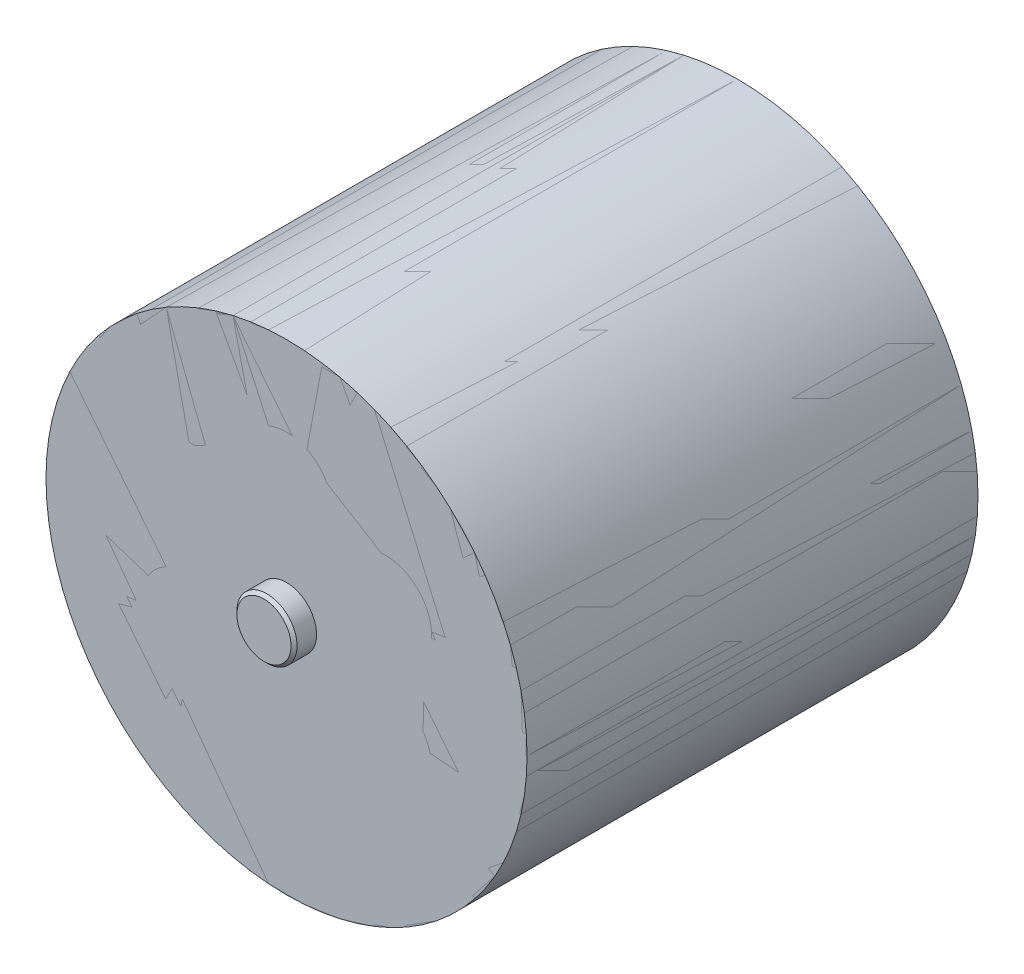
ISO-10303-21;
HEADER;
FILE_DESCRIPTION(('STEP AP214'),'2;1');
FILE_NAME('part.step','',(''),(''),'','','');
FILE_SCHEMA(('AUTOMOTIVE_DESIGN { 1 0 10303 214 1 1 1 1 }'));
ENDSEC;
DATA;
#1=APPLICATION_CONTEXT('core data for automotive mechanical design processes');
#2=APPLICATION_PROTOCOL_DEFINITION('international standard','automotive_design',2000,#1);
#3=PRODUCT_CONTEXT('',#1,'mechanical');
#4=PRODUCT('Part','Part','',(#3));
#5=PRODUCT_RELATED_PRODUCT_CATEGORY('part','',(#4));
#6=PRODUCT_DEFINITION_FORMATION('','',#4);
#7=PRODUCT_DEFINITION_CONTEXT('part definition',#1,'design');
#8=PRODUCT_DEFINITION('design','',#6,#7);
#9=PRODUCT_DEFINITION_SHAPE('','',#8);
#10=(LENGTH_UNIT() NAMED_UNIT(*) SI_UNIT(.MILLI.,.METRE.));
#11=(NAMED_UNIT(*) PLANE_ANGLE_UNIT() SI_UNIT($,.RADIAN.));
#12=(NAMED_UNIT(*) SI_UNIT($,.STERADIAN.) SOLID_ANGLE_UNIT());
#13=UNCERTAINTY_MEASURE_WITH_UNIT(LENGTH_MEASURE(1.E-05),#10,'distance_accuracy_value','');
#14=(GEOMETRIC_REPRESENTATION_CONTEXT(3) GLOBAL_UNCERTAINTY_ASSIGNED_CONTEXT((#13)) GLOBAL_UNIT_ASSIGNED_CONTEXT((#10,
#11,#12)) REPRESENTATION_CONTEXT('',''));
#15=CARTESIAN_POINT('',(0.,0.,0.));
#16=DIRECTION('',(0.,0.,1.));
#17=DIRECTION('',(1.,0.,0.));
#18=AXIS2_PLACEMENT_3D('',#15,#16,#17);
#19=CARTESIAN_POINT('',(271.211975438826,413.994449049259,-602.54833995939));
#20=DIRECTION('',(0.,0.,1.));
#21=DIRECTION('',(1.,0.,0.));
#22=AXIS2_PLACEMENT_3D('',#19,#20,#21);
#23=CYLINDRICAL_SURFACE('',#22,160.);
#24=CARTESIAN_POINT('',(271.211975438826,413.994449049259,-150.));
#25=DIRECTION('',(0.,0.,1.));
#26=DIRECTION('',(1.,0.,0.));
#27=AXIS2_PLACEMENT_3D('',#24,#25,#26);
#28=CIRCLE('',#27,160.);
#29=CARTESIAN_POINT('',(431.211975438826,413.994449049259,-150.));
#30=VERTEX_POINT('',#29);
#31=EDGE_CURVE('E11',#30,#30,#28,.F.);
#32=ORIENTED_EDGE('',*,*,#31,.F.);
#33=EDGE_LOOP('',(#32));
#34=FACE_BOUND('',#33,.T.);
#35=CARTESIAN_POINT('',(271.211975438826,413.994449049259,150.));
#36=DIRECTION('',(0.,0.,1.));
#37=DIRECTION('',(1.,0.,0.));
#38=AXIS2_PLACEMENT_3D('',#35,#36,#37);
#39=CIRCLE('',#38,160.);
#40=CARTESIAN_POINT('',(431.211975438826,413.994449049259,150.));
#41=VERTEX_POINT('',#40);
#42=EDGE_CURVE('E49',#41,#41,#39,.T.);
#43=ORIENTED_EDGE('',*,*,#42,.F.);
#44=EDGE_LOOP('',(#43));
#45=FACE_BOUND('',#44,.T.);
#46=ADVANCED_FACE('F43',(#34,#45),#23,.T.);
#47=CARTESIAN_POINT('',(271.211975438826,413.994449049259,150.));
#48=DIRECTION('',(0.,0.,1.));
#49=DIRECTION('',(1.,0.,0.));
#50=AXIS2_PLACEMENT_3D('',#47,#48,#49);
#51=PLANE('',#50);
#52=ORIENTED_EDGE('',*,*,#42,.T.);
#53=EDGE_LOOP('',(#52));
#54=FACE_BOUND('',#53,.T.);
#55=ADVANCED_FACE('F55',(#54),#51,.T.);
#56=CARTESIAN_POINT('',(271.211975438826,413.994449049259,-150.));
#57=DIRECTION('',(0.,0.,1.));
#58=DIRECTION('',(1.,0.,0.));
#59=AXIS2_PLACEMENT_3D('',#56,#57,#58);
#60=PLANE('',#59);
#61=ORIENTED_EDGE('',*,*,#31,.T.);
#62=EDGE_LOOP('',(#61));
#63=FACE_BOUND('',#62,.T.);
#64=ADVANCED_FACE('F62',(#63),#60,.F.);
#65=CLOSED_SHELL('',(#46,#55,#64));
#66=MANIFOLD_SOLID_BREP('B2',#65);
#67=CARTESIAN_POINT('',(271.211975438826,413.994449049259,150.));
#68=DIRECTION('',(0.,0.,1.));
#69=DIRECTION('',(1.,0.,0.));
#70=AXIS2_PLACEMENT_3D('',#67,#68,#69);
#71=PLANE('',#70);
#72=CARTESIAN_POINT('',(271.211975438826,413.994449049259,150.));
#73=DIRECTION('',(0.,0.,1.));
#74=DIRECTION('',(1.,0.,0.));
#75=AXIS2_PLACEMENT_3D('',#72,#73,#74);
#76=CIRCLE('',#75,160.);
#77=CARTESIAN_POINT('',(431.211975438826,413.994449049259,150.));
#78=VERTEX_POINT('',#77);
#79=EDGE_CURVE('E99',#78,#78,#76,.T.);
#80=ORIENTED_EDGE('',*,*,#79,.T.);
#81=EDGE_LOOP('',(#80));
#82=FACE_BOUND('',#81,.T.);
#83=CARTESIAN_POINT('',(271.211975438826,490.065575895642,150.));
#84=DIRECTION('',(0.,0.,1.));
#85=DIRECTION('',(1.,0.,0.));
#86=AXIS2_PLACEMENT_3D('',#83,#84,#85);
#87=CIRCLE('',#86,30.583998029491);
#88=CARTESIAN_POINT('',(301.795973468317,490.065575895642,150.));
#89=VERTEX_POINT('',#88);
#90=EDGE_CURVE('E105',#89,#89,#87,.T.);
#91=ORIENTED_EDGE('',*,*,#90,.F.);
#92=EDGE_LOOP('',(#91));
#93=FACE_BOUND('',#92,.T.);
#94=CARTESIAN_POINT('',(337.091503782302,452.03001247245,150.));
#95=DIRECTION('',(0.,0.,1.));
#96=DIRECTION('',(0.499999999999998,-0.86602540378444,0.));
#97=AXIS2_PLACEMENT_3D('',#94,#95,#96);
#98=CIRCLE('',#97,30.583998029491);
#99=CARTESIAN_POINT('',(352.383502797047,425.543493229618,150.));
#100=VERTEX_POINT('',#99);
#101=EDGE_CURVE('E111',#100,#100,#98,.T.);
#102=ORIENTED_EDGE('',*,*,#101,.F.);
#103=EDGE_LOOP('',(#102));
#104=FACE_BOUND('',#103,.T.);
#105=CARTESIAN_POINT('',(337.091503782301,375.958885626067,150.));
#106=DIRECTION('',(0.,0.,1.));
#107=DIRECTION('',(-0.500000000000004,-0.866025403784436,0.));
#108=AXIS2_PLACEMENT_3D('',#105,#106,#107);
#109=CIRCLE('',#108,30.583998029491);
#110=CARTESIAN_POINT('',(321.799504767556,349.472366383235,150.));
#111=VERTEX_POINT('',#110);
#112=EDGE_CURVE('E117',#111,#111,#109,.T.);
#113=ORIENTED_EDGE('',*,*,#112,.F.);
#114=EDGE_LOOP('',(#113));
#115=FACE_BOUND('',#114,.T.);
#116=CARTESIAN_POINT('',(271.211975438826,337.923322202876,150.));
#117=DIRECTION('',(0.,0.,1.));
#118=DIRECTION('',(-1.,0.,0.));
#119=AXIS2_PLACEMENT_3D('',#116,#117,#118);
#120=CIRCLE('',#119,30.583998029491);
#121=CARTESIAN_POINT('',(240.627977409335,337.923322202876,150.));
#122=VERTEX_POINT('',#121);
#123=EDGE_CURVE('E123',#122,#122,#120,.T.);
#124=ORIENTED_EDGE('',*,*,#123,.F.);
#125=EDGE_LOOP('',(#124));
#126=FACE_BOUND('',#125,.T.);
#127=CARTESIAN_POINT('',(205.332447095349,375.958885626068,150.));
#128=DIRECTION('',(0.,0.,1.));
#129=DIRECTION('',(-0.499999999999992,0.866025403784443,0.));
#130=AXIS2_PLACEMENT_3D('',#127,#128,#129);
#131=CIRCLE('',#130,30.583998029491);
#132=CARTESIAN_POINT('',(190.040448080604,402.4454048689,150.));
#133=VERTEX_POINT('',#132);
#134=EDGE_CURVE('E129',#133,#133,#131,.T.);
#135=ORIENTED_EDGE('',*,*,#134,.F.);
#136=EDGE_LOOP('',(#135));
#137=FACE_BOUND('',#136,.T.);
#138=CARTESIAN_POINT('',(205.33244709535,452.030012472451,150.));
#139=DIRECTION('',(0.,0.,1.));
#140=DIRECTION('',(0.50000000000001,0.866025403784433,0.));
#141=AXIS2_PLACEMENT_3D('',#138,#139,#140);
#142=CIRCLE('',#141,30.583998029491);
#143=CARTESIAN_POINT('',(220.624446110096,478.516531715283,150.));
#144=VERTEX_POINT('',#143);
#145=EDGE_CURVE('E135',#144,#144,#142,.T.);
#146=ORIENTED_EDGE('',*,*,#145,.F.);
#147=EDGE_LOOP('',(#146));
#148=FACE_BOUND('',#147,.T.);
#149=CARTESIAN_POINT('',(271.211975438826,413.994449049259,150.));
#150=DIRECTION('',(0.,0.,1.));
#151=DIRECTION('',(1.,0.,0.));
#152=AXIS2_PLACEMENT_3D('',#149,#150,#151);
#153=CIRCLE('',#152,20.);
#154=CARTESIAN_POINT('',(291.211975438826,413.994449049259,150.));
#155=VERTEX_POINT('',#154);
#156=EDGE_CURVE('E174',#155,#155,#153,.T.);
#157=ORIENTED_EDGE('',*,*,#156,.F.);
#158=EDGE_LOOP('',(#157));
#159=FACE_BOUND('',#158,.T.);
#160=ADVANCED_FACE('F84',(#82,#93,#104,#115,#126,#137,#148,#159),#71,.T.);
#161=CARTESIAN_POINT('',(271.211975438826,413.994449049259,-150.));
#162=DIRECTION('',(0.,0.,1.));
#163=DIRECTION('',(1.,0.,0.));
#164=AXIS2_PLACEMENT_3D('',#161,#162,#163);
#165=PLANE('',#164);
#166=CARTESIAN_POINT('',(271.211975438826,413.994449049259,-150.));
#167=DIRECTION('',(0.,0.,1.));
#168=DIRECTION('',(1.,0.,0.));
#169=AXIS2_PLACEMENT_3D('',#166,#167,#168);
#170=CIRCLE('',#169,20.);
#171=CARTESIAN_POINT('',(291.211975438826,413.994449049259,-150.));
#172=VERTEX_POINT('',#171);
#173=EDGE_CURVE('E180',#172,#172,#170,.T.);
#174=ORIENTED_EDGE('',*,*,#173,.T.);
#175=EDGE_LOOP('',(#174));
#176=FACE_BOUND('',#175,.T.);
#177=CARTESIAN_POINT('',(205.332447095349,375.958885626068,-150.));
#178=DIRECTION('',(0.,0.,1.));
#179=DIRECTION('',(-0.499999999999992,0.866025403784443,0.));
#180=AXIS2_PLACEMENT_3D('',#177,#178,#179);
#181=CIRCLE('',#180,30.583998029491);
#182=CARTESIAN_POINT('',(190.040448080604,402.4454048689,-150.));
#183=VERTEX_POINT('',#182);
#184=EDGE_CURVE('E165',#183,#183,#181,.T.);
#185=ORIENTED_EDGE('',*,*,#184,.T.);
#186=EDGE_LOOP('',(#185));
#187=FACE_BOUND('',#186,.T.);
#188=CARTESIAN_POINT('',(337.091503782301,375.958885626067,-150.));
#189=DIRECTION('',(0.,0.,1.));
#190=DIRECTION('',(-0.500000000000004,-0.866025403784436,0.));
#191=AXIS2_PLACEMENT_3D('',#188,#189,#190);
#192=CIRCLE('',#191,30.583998029491);
#193=CARTESIAN_POINT('',(321.799504767556,349.472366383235,-150.));
#194=VERTEX_POINT('',#193);
#195=EDGE_CURVE('E153',#194,#194,#192,.T.);
#196=ORIENTED_EDGE('',*,*,#195,.T.);
#197=EDGE_LOOP('',(#196));
#198=FACE_BOUND('',#197,.T.);
#199=CARTESIAN_POINT('',(271.211975438826,490.065575895642,-150.));
#200=DIRECTION('',(0.,0.,1.));
#201=DIRECTION('',(1.,0.,0.));
#202=AXIS2_PLACEMENT_3D('',#199,#200,#201);
#203=CIRCLE('',#202,30.583998029491);
#204=CARTESIAN_POINT('',(301.795973468317,490.065575895642,-150.));
#205=VERTEX_POINT('',#204);
#206=EDGE_CURVE('E141',#205,#205,#203,.T.);
#207=ORIENTED_EDGE('',*,*,#206,.T.);
#208=EDGE_LOOP('',(#207));
#209=FACE_BOUND('',#208,.T.);
#210=CARTESIAN_POINT('',(271.211975438826,413.994449049259,-150.));
#211=DIRECTION('',(0.,0.,1.));
#212=DIRECTION('',(1.,0.,0.));
#213=AXIS2_PLACEMENT_3D('',#210,#211,#212);
#214=CIRCLE('',#213,160.);
#215=CARTESIAN_POINT('',(431.211975438826,413.994449049259,-150.));
#216=VERTEX_POINT('',#215);
#217=EDGE_CURVE('E95',#216,#216,#214,.T.);
#218=ORIENTED_EDGE('',*,*,#217,.F.);
#219=EDGE_LOOP('',(#218));
#220=FACE_BOUND('',#219,.T.);
#221=CARTESIAN_POINT('',(337.091503782302,452.03001247245,-150.));
#222=DIRECTION('',(0.,0.,1.));
#223=DIRECTION('',(0.499999999999998,-0.86602540378444,0.));
#224=AXIS2_PLACEMENT_3D('',#221,#222,#223);
#225=CIRCLE('',#224,30.583998029491);
#226=CARTESIAN_POINT('',(352.383502797047,425.543493229618,-150.));
#227=VERTEX_POINT('',#226);
#228=EDGE_CURVE('E147',#227,#227,#225,.T.);
#229=ORIENTED_EDGE('',*,*,#228,.T.);
#230=EDGE_LOOP('',(#229));
#231=FACE_BOUND('',#230,.T.);
#232=CARTESIAN_POINT('',(271.211975438826,337.923322202876,-150.));
#233=DIRECTION('',(0.,0.,1.));
#234=DIRECTION('',(-1.,0.,0.));
#235=AXIS2_PLACEMENT_3D('',#232,#233,#234);
#236=CIRCLE('',#235,30.583998029491);
#237=CARTESIAN_POINT('',(240.627977409335,337.923322202876,-150.));
#238=VERTEX_POINT('',#237);
#239=EDGE_CURVE('E159',#238,#238,#236,.T.);
#240=ORIENTED_EDGE('',*,*,#239,.T.);
#241=EDGE_LOOP('',(#240));
#242=FACE_BOUND('',#241,.T.);
#243=CARTESIAN_POINT('',(205.33244709535,452.030012472451,-150.));
#244=DIRECTION('',(0.,0.,1.));
#245=DIRECTION('',(0.50000000000001,0.866025403784433,0.));
#246=AXIS2_PLACEMENT_3D('',#243,#244,#245);
#247=CIRCLE('',#246,30.583998029491);
#248=CARTESIAN_POINT('',(220.624446110096,478.516531715283,-150.));
#249=VERTEX_POINT('',#248);
#250=EDGE_CURVE('E171',#249,#249,#247,.T.);
#251=ORIENTED_EDGE('',*,*,#250,.T.);
#252=EDGE_LOOP('',(#251));
#253=FACE_BOUND('',#252,.T.);
#254=ADVANCED_FACE('F197',(#176,#187,#198,#209,#220,#231,#242,#253),#165,.F.);
#255=CARTESIAN_POINT('',(271.211975438826,413.994449049259,-150.));
#256=DIRECTION('',(0.,0.,1.));
#257=DIRECTION('',(1.,0.,0.));
#258=AXIS2_PLACEMENT_3D('',#255,#256,#257);
#259=CYLINDRICAL_SURFACE('',#258,160.);
#260=ORIENTED_EDGE('',*,*,#217,.T.);
#261=EDGE_LOOP('',(#260));
#262=FACE_BOUND('',#261,.T.);
#263=ORIENTED_EDGE('',*,*,#79,.F.);
#264=EDGE_LOOP('',(#263));
#265=FACE_BOUND('',#264,.T.);
#266=ADVANCED_FACE('F203',(#262,#265),#259,.T.);
#267=CARTESIAN_POINT('',(271.211975438826,490.065575895642,145.));
#268=DIRECTION('',(0.,0.,1.));
#269=DIRECTION('',(1.,0.,0.));
#270=AXIS2_PLACEMENT_3D('',#267,#268,#269);
#271=CYLINDRICAL_SURFACE('',#270,30.583998029491);
#272=CARTESIAN_POINT('',(271.211975438826,490.065575895642,145.));
#273=DIRECTION('',(0.,0.,1.));
#274=DIRECTION('',(1.,0.,0.));
#275=AXIS2_PLACEMENT_3D('',#272,#273,#274);
#276=CIRCLE('',#275,30.583998029491);
#277=CARTESIAN_POINT('',(301.795973468317,490.065575895642,145.));
#278=VERTEX_POINT('',#277);
#279=EDGE_CURVE('E103',#278,#278,#276,.T.);
#280=ORIENTED_EDGE('',*,*,#279,.F.);
#281=EDGE_LOOP('',(#280));
#282=FACE_BOUND('',#281,.T.);
#283=ORIENTED_EDGE('',*,*,#90,.T.);
#284=EDGE_LOOP('',(#283));
#285=FACE_BOUND('',#284,.T.);
#286=ADVANCED_FACE('F209',(#282,#285),#271,.F.);
#287=CARTESIAN_POINT('',(271.211975438826,490.065575895642,145.));
#288=DIRECTION('',(0.,0.,1.));
#289=DIRECTION('',(1.,0.,0.));
#290=AXIS2_PLACEMENT_3D('',#287,#288,#289);
#291=PLANE('',#290);
#292=ORIENTED_EDGE('',*,*,#279,.T.);
#293=EDGE_LOOP('',(#292));
#294=FACE_BOUND('',#293,.T.);
#295=ADVANCED_FACE('F214',(#294),#291,.T.);
#296=CARTESIAN_POINT('',(337.091503782302,452.03001247245,145.));
#297=DIRECTION('',(0.,0.,1.));
#298=DIRECTION('',(1.,0.,0.));
#299=AXIS2_PLACEMENT_3D('',#296,#297,#298);
#300=CYLINDRICAL_SURFACE('',#299,30.583998029491);
#301=CARTESIAN_POINT('',(337.091503782302,452.03001247245,145.));
#302=DIRECTION('',(0.,0.,1.));
#303=DIRECTION('',(0.499999999999998,-0.86602540378444,0.));
#304=AXIS2_PLACEMENT_3D('',#301,#302,#303);
#305=CIRCLE('',#304,30.583998029491);
#306=CARTESIAN_POINT('',(352.383502797047,425.543493229618,145.));
#307=VERTEX_POINT('',#306);
#308=EDGE_CURVE('E108',#307,#307,#305,.T.);
#309=ORIENTED_EDGE('',*,*,#308,.F.);
#310=EDGE_LOOP('',(#309));
#311=FACE_BOUND('',#310,.T.);
#312=ORIENTED_EDGE('',*,*,#101,.T.);
#313=EDGE_LOOP('',(#312));
#314=FACE_BOUND('',#313,.T.);
#315=ADVANCED_FACE('F315',(#311,#314),#300,.F.);
#316=CARTESIAN_POINT('',(337.091503782302,452.03001247245,145.));
#317=DIRECTION('',(0.,0.,1.));
#318=DIRECTION('',(0.499999999999998,-0.86602540378444,0.));
#319=AXIS2_PLACEMENT_3D('',#316,#317,#318);
#320=PLANE('',#319);
#321=ORIENTED_EDGE('',*,*,#308,.T.);
#322=EDGE_LOOP('',(#321));
#323=FACE_BOUND('',#322,.T.);
#324=ADVANCED_FACE('F311',(#323),#320,.T.);
#325=CARTESIAN_POINT('',(337.091503782301,375.958885626067,145.));
#326=DIRECTION('',(0.,0.,1.));
#327=DIRECTION('',(1.,0.,0.));
#328=AXIS2_PLACEMENT_3D('',#325,#326,#327);
#329=CYLINDRICAL_SURFACE('',#328,30.583998029491);
#330=CARTESIAN_POINT('',(337.091503782301,375.958885626067,145.));
#331=DIRECTION('',(0.,0.,1.));
#332=DIRECTION('',(-0.500000000000004,-0.866025403784436,0.));
#333=AXIS2_PLACEMENT_3D('',#330,#331,#332);
#334=CIRCLE('',#333,30.583998029491);
#335=CARTESIAN_POINT('',(321.799504767556,349.472366383235,145.));
#336=VERTEX_POINT('',#335);
#337=EDGE_CURVE('E114',#336,#336,#334,.T.);
#338=ORIENTED_EDGE('',*,*,#337,.F.);
#339=EDGE_LOOP('',(#338));
#340=FACE_BOUND('',#339,.T.);
#341=ORIENTED_EDGE('',*,*,#112,.T.);
#342=EDGE_LOOP('',(#341));
#343=FACE_BOUND('',#342,.T.);
#344=ADVANCED_FACE('F307',(#340,#343),#329,.F.);
#345=CARTESIAN_POINT('',(337.091503782301,375.958885626067,145.));
#346=DIRECTION('',(0.,0.,1.));
#347=DIRECTION('',(-0.500000000000004,-0.866025403784436,0.));
#348=AXIS2_PLACEMENT_3D('',#345,#346,#347);
#349=PLANE('',#348);
#350=ORIENTED_EDGE('',*,*,#337,.T.);
#351=EDGE_LOOP('',(#350));
#352=FACE_BOUND('',#351,.T.);
#353=ADVANCED_FACE('F303',(#352),#349,.T.);
#354=CARTESIAN_POINT('',(271.211975438826,337.923322202876,145.));
#355=DIRECTION('',(0.,0.,1.));
#356=DIRECTION('',(1.,0.,0.));
#357=AXIS2_PLACEMENT_3D('',#354,#355,#356);
#358=CYLINDRICAL_SURFACE('',#357,30.583998029491);
#359=CARTESIAN_POINT('',(271.211975438826,337.923322202876,145.));
#360=DIRECTION('',(0.,0.,1.));
#361=DIRECTION('',(-1.,0.,0.));
#362=AXIS2_PLACEMENT_3D('',#359,#360,#361);
#363=CIRCLE('',#362,30.583998029491);
#364=CARTESIAN_POINT('',(240.627977409335,337.923322202876,145.));
#365=VERTEX_POINT('',#364);
#366=EDGE_CURVE('E120',#365,#365,#363,.T.);
#367=ORIENTED_EDGE('',*,*,#366,.F.);
#368=EDGE_LOOP('',(#367));
#369=FACE_BOUND('',#368,.T.);
#370=ORIENTED_EDGE('',*,*,#123,.T.);
#371=EDGE_LOOP('',(#370));
#372=FACE_BOUND('',#371,.T.);
#373=ADVANCED_FACE('F299',(#369,#372),#358,.F.);
#374=CARTESIAN_POINT('',(271.211975438826,337.923322202876,145.));
#375=DIRECTION('',(0.,0.,1.));
#376=DIRECTION('',(-1.,0.,0.));
#377=AXIS2_PLACEMENT_3D('',#374,#375,#376);
#378=PLANE('',#377);
#379=ORIENTED_EDGE('',*,*,#366,.T.);
#380=EDGE_LOOP('',(#379));
#381=FACE_BOUND('',#380,.T.);
#382=ADVANCED_FACE('F295',(#381),#378,.T.);
#383=CARTESIAN_POINT('',(205.332447095349,375.958885626068,145.));
#384=DIRECTION('',(0.,0.,1.));
#385=DIRECTION('',(1.,0.,0.));
#386=AXIS2_PLACEMENT_3D('',#383,#384,#385);
#387=CYLINDRICAL_SURFACE('',#386,30.583998029491);
#388=CARTESIAN_POINT('',(205.332447095349,375.958885626068,145.));
#389=DIRECTION('',(0.,0.,1.));
#390=DIRECTION('',(-0.499999999999992,0.866025403784443,0.));
#391=AXIS2_PLACEMENT_3D('',#388,#389,#390);
#392=CIRCLE('',#391,30.583998029491);
#393=CARTESIAN_POINT('',(190.040448080604,402.4454048689,145.));
#394=VERTEX_POINT('',#393);
#395=EDGE_CURVE('E126',#394,#394,#392,.T.);
#396=ORIENTED_EDGE('',*,*,#395,.F.);
#397=EDGE_LOOP('',(#396));
#398=FACE_BOUND('',#397,.T.);
#399=ORIENTED_EDGE('',*,*,#134,.T.);
#400=EDGE_LOOP('',(#399));
#401=FACE_BOUND('',#400,.T.);
#402=ADVANCED_FACE('F291',(#398,#401),#387,.F.);
#403=CARTESIAN_POINT('',(205.332447095349,375.958885626068,145.));
#404=DIRECTION('',(0.,0.,1.));
#405=DIRECTION('',(-0.499999999999992,0.866025403784443,0.));
#406=AXIS2_PLACEMENT_3D('',#403,#404,#405);
#407=PLANE('',#406);
#408=ORIENTED_EDGE('',*,*,#395,.T.);
#409=EDGE_LOOP('',(#408));
#410=FACE_BOUND('',#409,.T.);
#411=ADVANCED_FACE('F287',(#410),#407,.T.);
#412=CARTESIAN_POINT('',(205.33244709535,452.030012472451,145.));
#413=DIRECTION('',(0.,0.,1.));
#414=DIRECTION('',(1.,0.,0.));
#415=AXIS2_PLACEMENT_3D('',#412,#413,#414);
#416=CYLINDRICAL_SURFACE('',#415,30.583998029491);
#417=CARTESIAN_POINT('',(205.33244709535,452.030012472451,145.));
#418=DIRECTION('',(0.,0.,1.));
#419=DIRECTION('',(0.50000000000001,0.866025403784433,0.));
#420=AXIS2_PLACEMENT_3D('',#417,#418,#419);
#421=CIRCLE('',#420,30.583998029491);
#422=CARTESIAN_POINT('',(220.624446110096,478.516531715283,145.));
#423=VERTEX_POINT('',#422);
#424=EDGE_CURVE('E132',#423,#423,#421,.T.);
#425=ORIENTED_EDGE('',*,*,#424,.F.);
#426=EDGE_LOOP('',(#425));
#427=FACE_BOUND('',#426,.T.);
#428=ORIENTED_EDGE('',*,*,#145,.T.);
#429=EDGE_LOOP('',(#428));
#430=FACE_BOUND('',#429,.T.);
#431=ADVANCED_FACE('F283',(#427,#430),#416,.F.);
#432=CARTESIAN_POINT('',(205.33244709535,452.030012472451,145.));
#433=DIRECTION('',(0.,0.,1.));
#434=DIRECTION('',(0.50000000000001,0.866025403784433,0.));
#435=AXIS2_PLACEMENT_3D('',#432,#433,#434);
#436=PLANE('',#435);
#437=ORIENTED_EDGE('',*,*,#424,.T.);
#438=EDGE_LOOP('',(#437));
#439=FACE_BOUND('',#438,.T.);
#440=ADVANCED_FACE('F279',(#439),#436,.T.);
#441=CARTESIAN_POINT('',(271.211975438826,490.065575895642,-145.));
#442=DIRECTION('',(0.,0.,-1.));
#443=DIRECTION('',(-1.,0.,0.));
#444=AXIS2_PLACEMENT_3D('',#441,#442,#443);
#445=CYLINDRICAL_SURFACE('',#444,30.583998029491);
#446=CARTESIAN_POINT('',(271.211975438826,490.065575895642,-145.));
#447=DIRECTION('',(0.,0.,1.));
#448=DIRECTION('',(1.,0.,0.));
#449=AXIS2_PLACEMENT_3D('',#446,#447,#448);
#450=CIRCLE('',#449,30.583998029491);
#451=CARTESIAN_POINT('',(301.795973468317,490.065575895642,-145.));
#452=VERTEX_POINT('',#451);
#453=EDGE_CURVE('E138',#452,#452,#450,.T.);
#454=ORIENTED_EDGE('',*,*,#453,.T.);
#455=EDGE_LOOP('',(#454));
#456=FACE_BOUND('',#455,.T.);
#457=ORIENTED_EDGE('',*,*,#206,.F.);
#458=EDGE_LOOP('',(#457));
#459=FACE_BOUND('',#458,.T.);
#460=ADVANCED_FACE('F275',(#456,#459),#445,.F.);
#461=CARTESIAN_POINT('',(271.211975438826,490.065575895642,-145.));
#462=DIRECTION('',(0.,0.,-1.));
#463=DIRECTION('',(1.,0.,0.));
#464=AXIS2_PLACEMENT_3D('',#461,#462,#463);
#465=PLANE('',#464);
#466=ORIENTED_EDGE('',*,*,#453,.F.);
#467=EDGE_LOOP('',(#466));
#468=FACE_BOUND('',#467,.T.);
#469=ADVANCED_FACE('F271',(#468),#465,.T.);
#470=CARTESIAN_POINT('',(337.091503782302,452.03001247245,-145.));
#471=DIRECTION('',(0.,0.,-1.));
#472=DIRECTION('',(-1.,0.,0.));
#473=AXIS2_PLACEMENT_3D('',#470,#471,#472);
#474=CYLINDRICAL_SURFACE('',#473,30.583998029491);
#475=CARTESIAN_POINT('',(337.091503782302,452.03001247245,-145.));
#476=DIRECTION('',(0.,0.,1.));
#477=DIRECTION('',(0.499999999999998,-0.86602540378444,0.));
#478=AXIS2_PLACEMENT_3D('',#475,#476,#477);
#479=CIRCLE('',#478,30.583998029491);
#480=CARTESIAN_POINT('',(352.383502797047,425.543493229618,-145.));
#481=VERTEX_POINT('',#480);
#482=EDGE_CURVE('E144',#481,#481,#479,.T.);
#483=ORIENTED_EDGE('',*,*,#482,.T.);
#484=EDGE_LOOP('',(#483));
#485=FACE_BOUND('',#484,.T.);
#486=ORIENTED_EDGE('',*,*,#228,.F.);
#487=EDGE_LOOP('',(#486));
#488=FACE_BOUND('',#487,.T.);
#489=ADVANCED_FACE('F267',(#485,#488),#474,.F.);
#490=CARTESIAN_POINT('',(337.091503782302,452.03001247245,-145.));
#491=DIRECTION('',(0.,0.,-1.));
#492=DIRECTION('',(0.499999999999998,-0.86602540378444,0.));
#493=AXIS2_PLACEMENT_3D('',#490,#491,#492);
#494=PLANE('',#493);
#495=ORIENTED_EDGE('',*,*,#482,.F.);
#496=EDGE_LOOP('',(#495));
#497=FACE_BOUND('',#496,.T.);
#498=ADVANCED_FACE('F263',(#497),#494,.T.);
#499=CARTESIAN_POINT('',(337.091503782301,375.958885626067,-145.));
#500=DIRECTION('',(0.,0.,-1.));
#501=DIRECTION('',(-1.,0.,0.));
#502=AXIS2_PLACEMENT_3D('',#499,#500,#501);
#503=CYLINDRICAL_SURFACE('',#502,30.583998029491);
#504=CARTESIAN_POINT('',(337.091503782301,375.958885626067,-145.));
#505=DIRECTION('',(0.,0.,1.));
#506=DIRECTION('',(-0.500000000000004,-0.866025403784436,0.));
#507=AXIS2_PLACEMENT_3D('',#504,#505,#506);
#508=CIRCLE('',#507,30.583998029491);
#509=CARTESIAN_POINT('',(321.799504767556,349.472366383235,-145.));
#510=VERTEX_POINT('',#509);
#511=EDGE_CURVE('E150',#510,#510,#508,.T.);
#512=ORIENTED_EDGE('',*,*,#511,.T.);
#513=EDGE_LOOP('',(#512));
#514=FACE_BOUND('',#513,.T.);
#515=ORIENTED_EDGE('',*,*,#195,.F.);
#516=EDGE_LOOP('',(#515));
#517=FACE_BOUND('',#516,.T.);
#518=ADVANCED_FACE('F259',(#514,#517),#503,.F.);
#519=CARTESIAN_POINT('',(337.091503782301,375.958885626067,-145.));
#520=DIRECTION('',(0.,0.,-1.));
#521=DIRECTION('',(-0.500000000000004,-0.866025403784436,0.));
#522=AXIS2_PLACEMENT_3D('',#519,#520,#521);
#523=PLANE('',#522);
#524=ORIENTED_EDGE('',*,*,#511,.F.);
#525=EDGE_LOOP('',(#524));
#526=FACE_BOUND('',#525,.T.);
#527=ADVANCED_FACE('F255',(#526),#523,.T.);
#528=CARTESIAN_POINT('',(271.211975438826,337.923322202876,-145.));
#529=DIRECTION('',(0.,0.,-1.));
#530=DIRECTION('',(-1.,0.,0.));
#531=AXIS2_PLACEMENT_3D('',#528,#529,#530);
#532=CYLINDRICAL_SURFACE('',#531,30.583998029491);
#533=CARTESIAN_POINT('',(271.211975438826,337.923322202876,-145.));
#534=DIRECTION('',(0.,0.,1.));
#535=DIRECTION('',(-1.,0.,0.));
#536=AXIS2_PLACEMENT_3D('',#533,#534,#535);
#537=CIRCLE('',#536,30.583998029491);
#538=CARTESIAN_POINT('',(240.627977409335,337.923322202876,-145.));
#539=VERTEX_POINT('',#538);
#540=EDGE_CURVE('E156',#539,#539,#537,.T.);
#541=ORIENTED_EDGE('',*,*,#540,.T.);
#542=EDGE_LOOP('',(#541));
#543=FACE_BOUND('',#542,.T.);
#544=ORIENTED_EDGE('',*,*,#239,.F.);
#545=EDGE_LOOP('',(#544));
#546=FACE_BOUND('',#545,.T.);
#547=ADVANCED_FACE('F251',(#543,#546),#532,.F.);
#548=CARTESIAN_POINT('',(271.211975438826,337.923322202876,-145.));
#549=DIRECTION('',(0.,0.,-1.));
#550=DIRECTION('',(-1.,0.,0.));
#551=AXIS2_PLACEMENT_3D('',#548,#549,#550);
#552=PLANE('',#551);
#553=ORIENTED_EDGE('',*,*,#540,.F.);
#554=EDGE_LOOP('',(#553));
#555=FACE_BOUND('',#554,.T.);
#556=ADVANCED_FACE('F247',(#555),#552,.T.);
#557=CARTESIAN_POINT('',(205.332447095349,375.958885626068,-145.));
#558=DIRECTION('',(0.,0.,-1.));
#559=DIRECTION('',(-1.,0.,0.));
#560=AXIS2_PLACEMENT_3D('',#557,#558,#559);
#561=CYLINDRICAL_SURFACE('',#560,30.583998029491);
#562=CARTESIAN_POINT('',(205.332447095349,375.958885626068,-145.));
#563=DIRECTION('',(0.,0.,1.));
#564=DIRECTION('',(-0.499999999999992,0.866025403784443,0.));
#565=AXIS2_PLACEMENT_3D('',#562,#563,#564);
#566=CIRCLE('',#565,30.583998029491);
#567=CARTESIAN_POINT('',(190.040448080604,402.4454048689,-145.));
#568=VERTEX_POINT('',#567);
#569=EDGE_CURVE('E162',#568,#568,#566,.T.);
#570=ORIENTED_EDGE('',*,*,#569,.T.);
#571=EDGE_LOOP('',(#570));
#572=FACE_BOUND('',#571,.T.);
#573=ORIENTED_EDGE('',*,*,#184,.F.);
#574=EDGE_LOOP('',(#573));
#575=FACE_BOUND('',#574,.T.);
#576=ADVANCED_FACE('F240',(#572,#575),#561,.F.);
#577=CARTESIAN_POINT('',(205.332447095349,375.958885626068,-145.));
#578=DIRECTION('',(0.,0.,-1.));
#579=DIRECTION('',(-0.499999999999992,0.866025403784443,0.));
#580=AXIS2_PLACEMENT_3D('',#577,#578,#579);
#581=PLANE('',#580);
#582=ORIENTED_EDGE('',*,*,#569,.F.);
#583=EDGE_LOOP('',(#582));
#584=FACE_BOUND('',#583,.T.);
#585=ADVANCED_FACE('F230',(#584),#581,.T.);
#586=CARTESIAN_POINT('',(205.33244709535,452.030012472451,-145.));
#587=DIRECTION('',(0.,0.,-1.));
#588=DIRECTION('',(-1.,0.,0.));
#589=AXIS2_PLACEMENT_3D('',#586,#587,#588);
#590=CYLINDRICAL_SURFACE('',#589,30.583998029491);
#591=CARTESIAN_POINT('',(205.33244709535,452.030012472451,-145.));
#592=DIRECTION('',(0.,0.,1.));
#593=DIRECTION('',(0.50000000000001,0.866025403784433,0.));
#594=AXIS2_PLACEMENT_3D('',#591,#592,#593);
#595=CIRCLE('',#594,30.583998029491);
#596=CARTESIAN_POINT('',(220.624446110096,478.516531715283,-145.));
#597=VERTEX_POINT('',#596);
#598=EDGE_CURVE('E168',#597,#597,#595,.T.);
#599=ORIENTED_EDGE('',*,*,#598,.T.);
#600=EDGE_LOOP('',(#599));
#601=FACE_BOUND('',#600,.T.);
#602=ORIENTED_EDGE('',*,*,#250,.F.);
#603=EDGE_LOOP('',(#602));
#604=FACE_BOUND('',#603,.T.);
#605=ADVANCED_FACE('F227',(#601,#604),#590,.F.);
#606=CARTESIAN_POINT('',(205.33244709535,452.030012472451,-145.));
#607=DIRECTION('',(0.,0.,-1.));
#608=DIRECTION('',(0.50000000000001,0.866025403784433,0.));
#609=AXIS2_PLACEMENT_3D('',#606,#607,#608);
#610=PLANE('',#609);
#611=ORIENTED_EDGE('',*,*,#598,.F.);
#612=EDGE_LOOP('',(#611));
#613=FACE_BOUND('',#612,.T.);
#614=ADVANCED_FACE('F229',(#613),#610,.T.);
#615=CARTESIAN_POINT('',(271.211975438826,413.994449049259,165.));
#616=DIRECTION('',(0.,0.,-1.));
#617=DIRECTION('',(-1.,0.,0.));
#618=AXIS2_PLACEMENT_3D('',#615,#616,#617);
#619=CYLINDRICAL_SURFACE('',#618,20.);
#620=CARTESIAN_POINT('',(271.211975438826,413.994449049259,163.));
#621=DIRECTION('',(0.,0.,1.));
#622=DIRECTION('',(1.,0.,0.));
#623=AXIS2_PLACEMENT_3D('',#620,#621,#622);
#624=CIRCLE('',#623,20.);
#625=CARTESIAN_POINT('',(291.211975438826,413.994449049259,163.));
#626=VERTEX_POINT('',#625);
#627=EDGE_CURVE('E42',#626,#626,#624,.F.);
#628=ORIENTED_EDGE('',*,*,#627,.T.);
#629=EDGE_LOOP('',(#628));
#630=FACE_BOUND('',#629,.T.);
#631=ORIENTED_EDGE('',*,*,#156,.T.);
#632=EDGE_LOOP('',(#631));
#633=FACE_BOUND('',#632,.T.);
#634=ADVANCED_FACE('F237',(#630,#633),#619,.T.);
#635=CARTESIAN_POINT('',(271.211975438826,413.994449049259,165.));
#636=DIRECTION('',(0.,0.,1.));
#637=DIRECTION('',(1.,0.,0.));
#638=AXIS2_PLACEMENT_3D('',#635,#636,#637);
#639=PLANE('',#638);
#640=CARTESIAN_POINT('',(271.211975438826,413.994449049259,165.));
#641=DIRECTION('',(0.,0.,1.));
#642=DIRECTION('',(1.,0.,0.));
#643=AXIS2_PLACEMENT_3D('',#640,#641,#642);
#644=CIRCLE('',#643,18.);
#645=CARTESIAN_POINT('',(289.211975438826,413.994449049259,165.));
#646=VERTEX_POINT('',#645);
#647=EDGE_CURVE('E91',#646,#646,#644,.T.);
#648=ORIENTED_EDGE('',*,*,#647,.T.);
#649=EDGE_LOOP('',(#648));
#650=FACE_BOUND('',#649,.T.);
#651=ADVANCED_FACE('F341',(#650),#639,.T.);
#652=CARTESIAN_POINT('',(271.211975438826,413.994449049259,165.));
#653=DIRECTION('',(0.,0.,-1.));
#654=DIRECTION('',(-1.,0.,0.));
#655=AXIS2_PLACEMENT_3D('',#652,#653,#654);
#656=CONICAL_SURFACE('',#655,18.,0.785398163397463);
#657=ORIENTED_EDGE('',*,*,#627,.F.);
#658=EDGE_LOOP('',(#657));
#659=FACE_BOUND('',#658,.T.);
#660=ORIENTED_EDGE('',*,*,#647,.F.);
#661=EDGE_LOOP('',(#660));
#662=FACE_BOUND('',#661,.T.);
#663=ADVANCED_FACE('F86',(#659,#662),#656,.T.);
#664=CARTESIAN_POINT('',(271.211975438826,413.994449049259,-165.));
#665=DIRECTION('',(0.,0.,1.));
#666=DIRECTION('',(1.,0.,0.));
#667=AXIS2_PLACEMENT_3D('',#664,#665,#666);
#668=CYLINDRICAL_SURFACE('',#667,20.);
#669=CARTESIAN_POINT('',(271.211975438826,413.994449049259,-165.));
#670=DIRECTION('',(0.,0.,1.));
#671=DIRECTION('',(1.,0.,0.));
#672=AXIS2_PLACEMENT_3D('',#669,#670,#671);
#673=CIRCLE('',#672,20.);
#674=CARTESIAN_POINT('',(291.211975438826,413.994449049259,-165.));
#675=VERTEX_POINT('',#674);
#676=EDGE_CURVE('E179',#675,#675,#673,.T.);
#677=ORIENTED_EDGE('',*,*,#676,.T.);
#678=EDGE_LOOP('',(#677));
#679=FACE_BOUND('',#678,.T.);
#680=ORIENTED_EDGE('',*,*,#173,.F.);
#681=EDGE_LOOP('',(#680));
#682=FACE_BOUND('',#681,.T.);
#683=ADVANCED_FACE('F186',(#679,#682),#668,.T.);
#684=CARTESIAN_POINT('',(271.211975438826,413.994449049259,-165.));
#685=DIRECTION('',(0.,0.,-1.));
#686=DIRECTION('',(1.,0.,0.));
#687=AXIS2_PLACEMENT_3D('',#684,#685,#686);
#688=PLANE('',#687);
#689=ORIENTED_EDGE('',*,*,#676,.F.);
#690=EDGE_LOOP('',(#689));
#691=FACE_BOUND('',#690,.T.);
#692=ADVANCED_FACE('F189',(#691),#688,.T.);
#693=CLOSED_SHELL('',(#160,#254,#266,#286,#295,#315,#324,#344,#353,#373,#382,#402,#411,#431,
#440,#460,#469,#489,#498,#518,#527,#547,#556,#576,#585,#605,#614,#634,#651,#663,#683,#692));
#694=MANIFOLD_SOLID_BREP('B6',#693);
#695=ADVANCED_BREP_SHAPE_REPRESENTATION('',(#18,#66,#694),#14);
#696=SHAPE_DEFINITION_REPRESENTATION(#9,#695);
ENDSEC;
END-ISO-10303-21;
